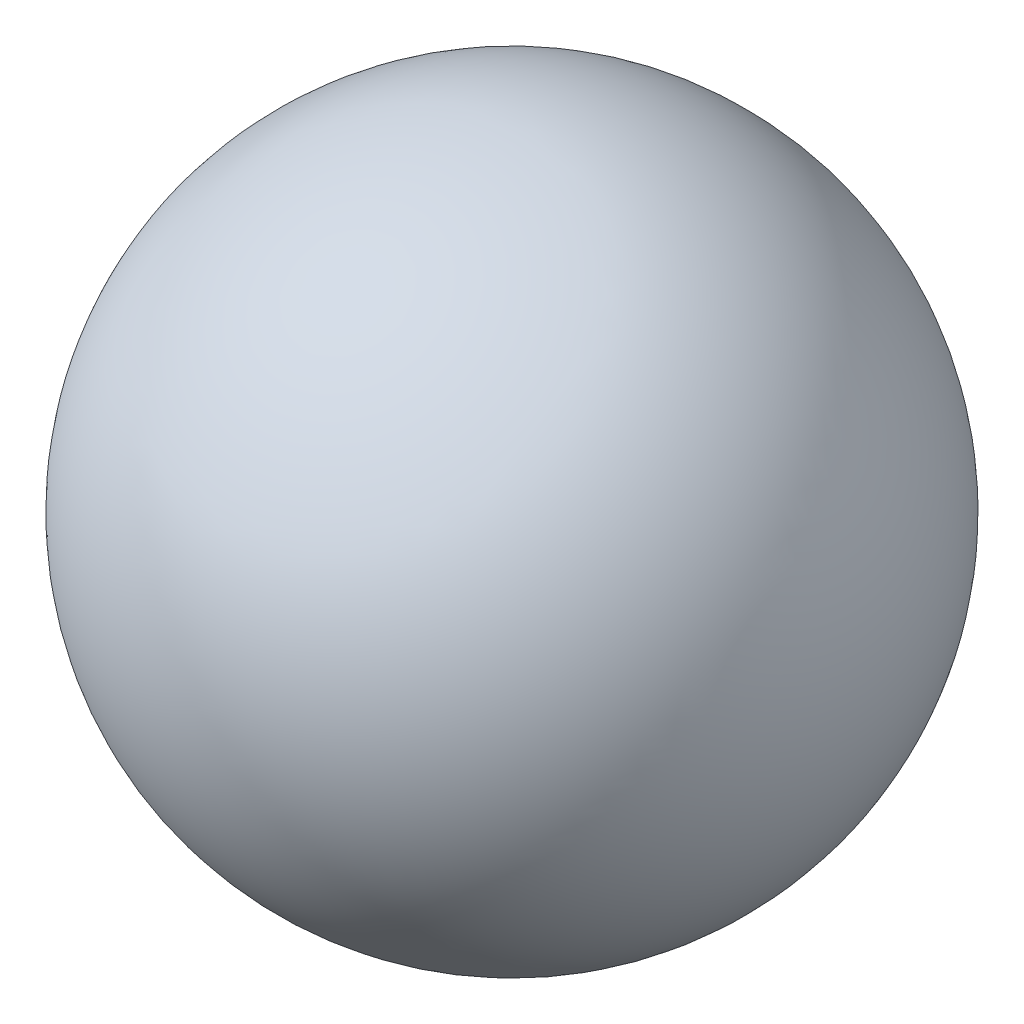
ISO-10303-21;
HEADER;
FILE_DESCRIPTION(('STEP AP214'),'2;1');
FILE_NAME('part.step','',(''),(''),'','','');
FILE_SCHEMA(('AUTOMOTIVE_DESIGN { 1 0 10303 214 1 1 1 1 }'));
ENDSEC;
DATA;
#1=APPLICATION_CONTEXT('core data for automotive mechanical design processes');
#2=APPLICATION_PROTOCOL_DEFINITION('international standard','automotive_design',2000,#1);
#3=PRODUCT_CONTEXT('',#1,'mechanical');
#4=PRODUCT('Part','Part','',(#3));
#5=PRODUCT_RELATED_PRODUCT_CATEGORY('part','',(#4));
#6=PRODUCT_DEFINITION_FORMATION('','',#4);
#7=PRODUCT_DEFINITION_CONTEXT('part definition',#1,'design');
#8=PRODUCT_DEFINITION('design','',#6,#7);
#9=PRODUCT_DEFINITION_SHAPE('','',#8);
#10=(LENGTH_UNIT() NAMED_UNIT(*) SI_UNIT(.MILLI.,.METRE.));
#11=(NAMED_UNIT(*) PLANE_ANGLE_UNIT() SI_UNIT($,.RADIAN.));
#12=(NAMED_UNIT(*) SI_UNIT($,.STERADIAN.) SOLID_ANGLE_UNIT());
#13=UNCERTAINTY_MEASURE_WITH_UNIT(LENGTH_MEASURE(1.E-05),#10,'distance_accuracy_value','');
#14=(GEOMETRIC_REPRESENTATION_CONTEXT(3) GLOBAL_UNCERTAINTY_ASSIGNED_CONTEXT((#13)) GLOBAL_UNIT_ASSIGNED_CONTEXT((#10,
#11,#12)) REPRESENTATION_CONTEXT('',''));
#15=CARTESIAN_POINT('',(0.,0.,0.));
#16=DIRECTION('',(0.,0.,1.));
#17=DIRECTION('',(1.,0.,0.));
#18=AXIS2_PLACEMENT_3D('',#15,#16,#17);
#19=CARTESIAN_POINT('',(0.,0.,0.));
#20=DIRECTION('',(-1.,0.,0.));
#21=DIRECTION('',(0.,1.,0.));
#22=AXIS2_PLACEMENT_3D('',#19,#20,#21);
#23=SPHERICAL_SURFACE('',#22,21.25);
#24=CARTESIAN_POINT('',(-21.25,0.,0.));
#25=VERTEX_POINT('',#24);
#26=VERTEX_LOOP('',#25);
#27=FACE_BOUND('',#26,.T.);
#28=ADVANCED_FACE('F31',(#27),#23,.T.);
#29=CLOSED_SHELL('',(#28));
#30=MANIFOLD_SOLID_BREP('B2',#29);
#31=ADVANCED_BREP_SHAPE_REPRESENTATION('',(#18,#30),#14);
#32=SHAPE_DEFINITION_REPRESENTATION(#9,#31);
ENDSEC;
END-ISO-10303-21;
